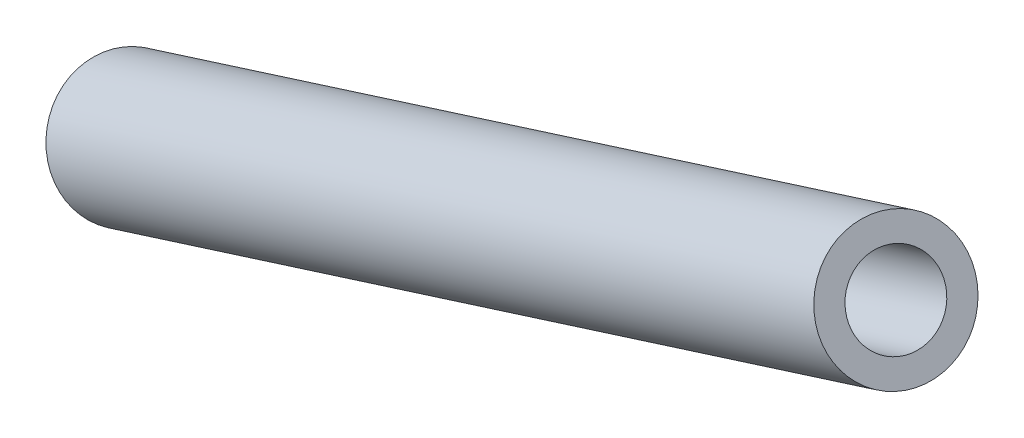
ISO-10303-21;
HEADER;
FILE_DESCRIPTION(('STEP AP214'),'2;1');
FILE_NAME('part.step','',(''),(''),'','','');
FILE_SCHEMA(('AUTOMOTIVE_DESIGN { 1 0 10303 214 1 1 1 1 }'));
ENDSEC;
DATA;
#1=APPLICATION_CONTEXT('core data for automotive mechanical design processes');
#2=APPLICATION_PROTOCOL_DEFINITION('international standard','automotive_design',2000,#1);
#3=PRODUCT_CONTEXT('',#1,'mechanical');
#4=PRODUCT('Part','Part','',(#3));
#5=PRODUCT_RELATED_PRODUCT_CATEGORY('part','',(#4));
#6=PRODUCT_DEFINITION_FORMATION('','',#4);
#7=PRODUCT_DEFINITION_CONTEXT('part definition',#1,'design');
#8=PRODUCT_DEFINITION('design','',#6,#7);
#9=PRODUCT_DEFINITION_SHAPE('','',#8);
#10=(LENGTH_UNIT() NAMED_UNIT(*) SI_UNIT(.MILLI.,.METRE.));
#11=(NAMED_UNIT(*) PLANE_ANGLE_UNIT() SI_UNIT($,.RADIAN.));
#12=(NAMED_UNIT(*) SI_UNIT($,.STERADIAN.) SOLID_ANGLE_UNIT());
#13=UNCERTAINTY_MEASURE_WITH_UNIT(LENGTH_MEASURE(1.E-05),#10,'distance_accuracy_value','');
#14=(GEOMETRIC_REPRESENTATION_CONTEXT(3) GLOBAL_UNCERTAINTY_ASSIGNED_CONTEXT((#13)) GLOBAL_UNIT_ASSIGNED_CONTEXT((#10,
#11,#12)) REPRESENTATION_CONTEXT('',''));
#15=CARTESIAN_POINT('',(0.,0.,0.));
#16=DIRECTION('',(0.,0.,1.));
#17=DIRECTION('',(1.,0.,0.));
#18=AXIS2_PLACEMENT_3D('',#15,#16,#17);
#19=CARTESIAN_POINT('',(-74.444753684597,-97.0848251686542,-12.9025849114731));
#20=DIRECTION('',(0.869739963853115,0.435019425763826,0.233046120939381));
#21=DIRECTION('',(-0.447336531418005,0.894365712479469,0.));
#22=AXIS2_PLACEMENT_3D('',#19,#20,#21);
#23=CYLINDRICAL_SURFACE('',#22,2.5);
#24=CARTESIAN_POINT('',(-74.444753684597,-97.0848251686542,-12.9025849114731));
#25=DIRECTION('',(-0.869739963853115,-0.435019425763826,-0.233046120939381));
#26=DIRECTION('',(0.447336531418005,-0.894365712479469,0.));
#27=AXIS2_PLACEMENT_3D('',#24,#25,#26);
#28=CIRCLE('',#27,2.5);
#29=CARTESIAN_POINT('',(-73.326412356052,-99.3207394498528,-12.9025849114731));
#30=VERTEX_POINT('',#29);
#31=EDGE_CURVE('E10',#30,#30,#28,.T.);
#32=ORIENTED_EDGE('',*,*,#31,.F.);
#33=EDGE_LOOP('',(#32));
#34=FACE_BOUND('',#33,.T.);
#35=CARTESIAN_POINT('',(-34.1193109206581,-76.9151748318745,-2.09741508845444));
#36=DIRECTION('',(-0.869739963853115,-0.435019425763826,-0.233046120939381));
#37=DIRECTION('',(0.447336531418005,-0.894365712479469,0.));
#38=AXIS2_PLACEMENT_3D('',#35,#36,#37);
#39=CIRCLE('',#38,2.5);
#40=CARTESIAN_POINT('',(-33.0009695921131,-79.1510891130731,-2.09741508845444));
#41=VERTEX_POINT('',#40);
#42=EDGE_CURVE('E46',#41,#41,#39,.T.);
#43=ORIENTED_EDGE('',*,*,#42,.T.);
#44=EDGE_LOOP('',(#43));
#45=FACE_BOUND('',#44,.T.);
#46=ADVANCED_FACE('F39',(#34,#45),#23,.T.);
#47=CARTESIAN_POINT('',(-74.444753684597,-97.0848251686542,-12.9025849114731));
#48=DIRECTION('',(-0.869739963853115,-0.435019425763826,-0.233046120939381));
#49=DIRECTION('',(0.447336531418005,-0.894365712479469,0.));
#50=AXIS2_PLACEMENT_3D('',#47,#48,#49);
#51=PLANE('',#50);
#52=CARTESIAN_POINT('',(-74.444753684597,-97.0848251686542,-12.9025849114731));
#53=DIRECTION('',(-0.869739963853115,-0.435019425763826,-0.233046120939381));
#54=DIRECTION('',(0.447336531418005,-0.894365712479469,0.));
#55=AXIS2_PLACEMENT_3D('',#52,#53,#54);
#56=CIRCLE('',#55,1.55);
#57=CARTESIAN_POINT('',(-75.1381253082949,-95.698558314311,-12.9025849114731));
#58=VERTEX_POINT('',#57);
#59=EDGE_CURVE('E51',#58,#58,#56,.F.);
#60=ORIENTED_EDGE('',*,*,#59,.T.);
#61=EDGE_LOOP('',(#60));
#62=FACE_BOUND('',#61,.T.);
#63=ORIENTED_EDGE('',*,*,#31,.T.);
#64=EDGE_LOOP('',(#63));
#65=FACE_BOUND('',#64,.T.);
#66=ADVANCED_FACE('F63',(#62,#65),#51,.T.);
#67=CARTESIAN_POINT('',(-34.1193109206581,-76.9151748318745,-2.09741508845444));
#68=DIRECTION('',(-0.869739963853115,-0.435019425763826,-0.233046120939381));
#69=DIRECTION('',(0.447336531418005,-0.894365712479469,0.));
#70=AXIS2_PLACEMENT_3D('',#67,#68,#69);
#71=PLANE('',#70);
#72=CARTESIAN_POINT('',(-34.1193109206581,-76.9151748318745,-2.09741508845443));
#73=DIRECTION('',(-0.869739963853115,-0.435019425763826,-0.233046120939381));
#74=DIRECTION('',(0.447336531418005,-0.894365712479469,0.));
#75=AXIS2_PLACEMENT_3D('',#72,#73,#74);
#76=CIRCLE('',#75,1.55);
#77=CARTESIAN_POINT('',(-34.812682544356,-75.5289079775313,-2.09741508845443));
#78=VERTEX_POINT('',#77);
#79=EDGE_CURVE('E45',#78,#78,#76,.F.);
#80=ORIENTED_EDGE('',*,*,#79,.F.);
#81=EDGE_LOOP('',(#80));
#82=FACE_BOUND('',#81,.T.);
#83=ORIENTED_EDGE('',*,*,#42,.F.);
#84=EDGE_LOOP('',(#83));
#85=FACE_BOUND('',#84,.T.);
#86=ADVANCED_FACE('F61',(#82,#85),#71,.F.);
#87=CARTESIAN_POINT('',(-74.5317276809823,-97.1283271112306,-12.925889523567));
#88=DIRECTION('',(0.869739963853115,0.435019425763827,0.233046120939381));
#89=DIRECTION('',(-0.447336531418006,0.894365712479469,0.));
#90=AXIS2_PLACEMENT_3D('',#87,#88,#89);
#91=CYLINDRICAL_SURFACE('',#90,1.55);
#92=CARTESIAN_POINT('',(-75.1381253082949,-95.698558314311,-12.9025849114731));
#93=CARTESIAN_POINT('',(-74.7180686128372,-95.4884577899695,-12.79003105915));
#94=CARTESIAN_POINT('',(-74.2980119173795,-95.2783572656281,-12.6774772068268));
#95=CARTESIAN_POINT('',(-73.4578985264641,-94.8581562169452,-12.4523695021806));
#96=CARTESIAN_POINT('',(-73.0378418310064,-94.6480556926037,-12.3398156498575));
#97=CARTESIAN_POINT('',(-72.197728440091,-94.2278546439208,-12.1147079452113));
#98=CARTESIAN_POINT('',(-71.7776717446333,-94.0177541195794,-12.0021540928882));
#99=CARTESIAN_POINT('',(-70.9375583537179,-93.5975530708965,-11.777046388242));
#100=CARTESIAN_POINT('',(-70.5175016582602,-93.387452546555,-11.6644925359188));
#101=CARTESIAN_POINT('',(-69.6773882673449,-92.9672514978721,-11.4393848312726));
#102=CARTESIAN_POINT('',(-69.2573315718871,-92.7571509735306,-11.3268309789495));
#103=CARTESIAN_POINT('',(-68.4172181809718,-92.3369499248477,-11.1017232743033));
#104=CARTESIAN_POINT('',(-67.997161485514,-92.1268494005063,-10.9891694219802));
#105=CARTESIAN_POINT('',(-67.1570480945987,-91.7066483518233,-10.764061717334));
#106=CARTESIAN_POINT('',(-66.736991399141,-91.4965478274819,-10.6515078650109));
#107=CARTESIAN_POINT('',(-65.8968780082256,-91.076346778799,-10.4264001603646));
#108=CARTESIAN_POINT('',(-65.4768213127679,-90.8662462544575,-10.3138463080415));
#109=CARTESIAN_POINT('',(-64.6367079218525,-90.4460452057746,-10.0887386033953));
#110=CARTESIAN_POINT('',(-64.2166512263948,-90.2359446814332,-9.97618475107219));
#111=CARTESIAN_POINT('',(-63.3765378354794,-89.8157436327503,-9.75107704642597));
#112=CARTESIAN_POINT('',(-62.9564811400217,-89.6056431084088,-9.63852319410286));
#113=CARTESIAN_POINT('',(-62.1163677491063,-89.1854420597259,-9.41341548945663));
#114=CARTESIAN_POINT('',(-61.6963110536486,-88.9753415353844,-9.30086163713352));
#115=CARTESIAN_POINT('',(-60.8561976627332,-88.5551404867015,-9.0757539324873));
#116=CARTESIAN_POINT('',(-60.4361409672755,-88.34503996236,-8.96320008016419));
#117=CARTESIAN_POINT('',(-59.5960275763601,-87.9248389136771,-8.73809237551797));
#118=CARTESIAN_POINT('',(-59.1759708809024,-87.7147383893357,-8.62553852319486));
#119=CARTESIAN_POINT('',(-58.335857489987,-87.2945373406528,-8.40043081854864));
#120=CARTESIAN_POINT('',(-57.9158007945293,-87.0844368163113,-8.28787696622553));
#121=CARTESIAN_POINT('',(-57.0756874036139,-86.6642357676284,-8.0627692615793));
#122=CARTESIAN_POINT('',(-56.6556307081562,-86.454135243287,-7.95021540925619));
#123=CARTESIAN_POINT('',(-55.8155173172408,-86.033934194604,-7.72510770460997));
#124=CARTESIAN_POINT('',(-55.3954606217831,-85.8238336702626,-7.61255385228686));
#125=CARTESIAN_POINT('',(-54.5553472308677,-85.4036326215797,-7.38744614764064));
#126=CARTESIAN_POINT('',(-54.13529053541,-85.1935320972382,-7.27489229531753));
#127=CARTESIAN_POINT('',(-53.2951771444946,-84.7733310485553,-7.04978459067131));
#128=CARTESIAN_POINT('',(-52.8751204490369,-84.5632305242139,-6.9372307383482));
#129=CARTESIAN_POINT('',(-52.0350070581216,-84.143029475531,-6.71212303370197));
#130=CARTESIAN_POINT('',(-51.6149503626639,-83.9329289511895,-6.59956918137886));
#131=CARTESIAN_POINT('',(-50.7748369717485,-83.5127279025066,-6.37446147673264));
#132=CARTESIAN_POINT('',(-50.3547802762908,-83.3026273781651,-6.26190762440953));
#133=CARTESIAN_POINT('',(-49.5146668853754,-82.8824263294822,-6.03679991976331));
#134=CARTESIAN_POINT('',(-49.0946101899177,-82.6723258051407,-5.9242460674402));
#135=CARTESIAN_POINT('',(-48.2544967990023,-82.2521247564578,-5.69913836279398));
#136=CARTESIAN_POINT('',(-47.8344401035446,-82.0420242321164,-5.58658451047087));
#137=CARTESIAN_POINT('',(-46.9943267126292,-81.6218231834335,-5.36147680582464));
#138=CARTESIAN_POINT('',(-46.5742700171715,-81.411722659092,-5.24892295350153));
#139=CARTESIAN_POINT('',(-45.7341566262561,-80.9915216104091,-5.02381524885531));
#140=CARTESIAN_POINT('',(-45.3140999307984,-80.7814210860677,-4.9112613965322));
#141=CARTESIAN_POINT('',(-44.473986539883,-80.3612200373847,-4.68615369188598));
#142=CARTESIAN_POINT('',(-44.0539298444253,-80.1511195130433,-4.57359983956287));
#143=CARTESIAN_POINT('',(-43.2138164535099,-79.7309184643604,-4.34849213491665));
#144=CARTESIAN_POINT('',(-42.7937597580522,-79.5208179400189,-4.23593828259354));
#145=CARTESIAN_POINT('',(-41.9536463671368,-79.100616891336,-4.01083057794732));
#146=CARTESIAN_POINT('',(-41.5335896716791,-78.8905163669945,-3.8982767256242));
#147=CARTESIAN_POINT('',(-40.6934762807637,-78.4703153183116,-3.67316902097798));
#148=CARTESIAN_POINT('',(-40.273419585306,-78.2602147939702,-3.56061516865487));
#149=CARTESIAN_POINT('',(-39.4333061943906,-77.8400137452873,-3.33550746400865));
#150=CARTESIAN_POINT('',(-39.0132494989329,-77.6299132209458,-3.22295361168554));
#151=CARTESIAN_POINT('',(-38.1731361080175,-77.2097121722629,-2.99784590703932));
#152=CARTESIAN_POINT('',(-37.7530794125598,-76.9996116479215,-2.88529205471621));
#153=CARTESIAN_POINT('',(-36.9129660216444,-76.5794105992386,-2.66018435006999));
#154=CARTESIAN_POINT('',(-36.4929093261867,-76.3693100748971,-2.54763049774688));
#155=CARTESIAN_POINT('',(-35.6527959352714,-75.9491090262142,-2.32252279310066));
#156=CARTESIAN_POINT('',(-35.2327392398137,-75.7390085018727,-2.20996894077755));
#157=CARTESIAN_POINT('',(-34.812682544356,-75.5289079775313,-2.09741508845443));
#158=B_SPLINE_CURVE_WITH_KNOTS('',3,(#92,#93,#94,#95,#96,#97,#98,#99,#100,#101,#102,#103,#104,
#105,#106,#107,#108,#109,#110,#111,#112,#113,#114,#115,#116,#117,#118,#119,#120,#121,#122,#123,
#124,#125,#126,#127,#128,#129,#130,#131,#132,#133,#134,#135,#136,#137,#138,#139,#140,#141,#142,
#143,#144,#145,#146,#147,#148,#149,#150,#151,#152,#153,#154,#155,#156,#157),.UNSPECIFIED.,.F.,
.F.,(4,2,2,2,2,2,2,2,2,2,2,2,2,2,2,2,2,2,2,2,2,2,2,2,2,2,2,2,2,2,2,2,4),(0.,1.44890442976807,
2.89780885953613,4.34671328930419,5.79561771907225,7.24452214884032,8.69342657860838,
10.1423310083764,11.5912354381445,13.0401398679126,14.4890442976806,15.9379487274487,
17.3868531572168,18.8357575869848,20.2846620167529,21.7335664465209,23.182470876289,
24.6313753060571,26.0802797358251,27.5291841655932,28.9780885953612,30.4269930251293,
31.8758974548974,33.3248018846654,34.7737063144335,36.2226107442016,37.6715151739696,
39.1204196037377,40.5693240335057,42.0182284632738,43.4671328930419,44.9160373228099,
46.364941752578),.UNSPECIFIED.);
#159=EDGE_CURVE('BSEAM56',#58,#78,#158,.T.);
#160=ORIENTED_EDGE('',*,*,#59,.F.);
#161=ORIENTED_EDGE('',*,*,#79,.T.);
#162=ORIENTED_EDGE('',*,*,#159,.T.);
#163=ORIENTED_EDGE('',*,*,#159,.F.);
#164=EDGE_LOOP('',(#160,#162,#161,#163));
#165=FACE_BOUND('',#164,.T.);
#166=ADVANCED_FACE('F56',(#165),#91,.F.);
#167=CLOSED_SHELL('',(#46,#66,#86,#166));
#168=MANIFOLD_SOLID_BREP('B2',#167);
#169=ADVANCED_BREP_SHAPE_REPRESENTATION('',(#18,#168),#14);
#170=SHAPE_DEFINITION_REPRESENTATION(#9,#169);
ENDSEC;
END-ISO-10303-21;
